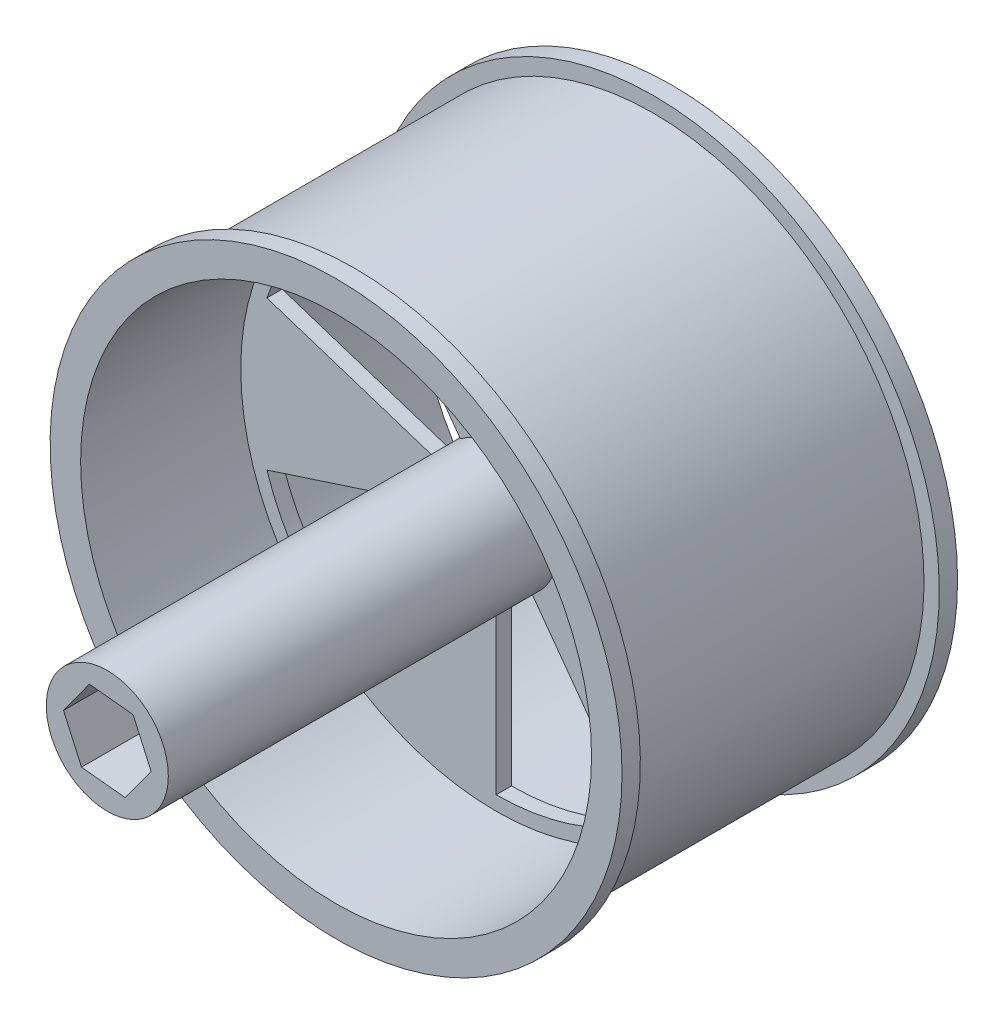
ISO-10303-21;
HEADER;
FILE_DESCRIPTION(('STEP AP214'),'2;1');
FILE_NAME('part.step','',(''),(''),'','','');
FILE_SCHEMA(('AUTOMOTIVE_DESIGN { 1 0 10303 214 1 1 1 1 }'));
ENDSEC;
DATA;
#1=APPLICATION_CONTEXT('core data for automotive mechanical design processes');
#2=APPLICATION_PROTOCOL_DEFINITION('international standard','automotive_design',2000,#1);
#3=PRODUCT_CONTEXT('',#1,'mechanical');
#4=PRODUCT('Part','Part','',(#3));
#5=PRODUCT_RELATED_PRODUCT_CATEGORY('part','',(#4));
#6=PRODUCT_DEFINITION_FORMATION('','',#4);
#7=PRODUCT_DEFINITION_CONTEXT('part definition',#1,'design');
#8=PRODUCT_DEFINITION('design','',#6,#7);
#9=PRODUCT_DEFINITION_SHAPE('','',#8);
#10=(LENGTH_UNIT() NAMED_UNIT(*) SI_UNIT(.MILLI.,.METRE.));
#11=(NAMED_UNIT(*) PLANE_ANGLE_UNIT() SI_UNIT($,.RADIAN.));
#12=(NAMED_UNIT(*) SI_UNIT($,.STERADIAN.) SOLID_ANGLE_UNIT());
#13=UNCERTAINTY_MEASURE_WITH_UNIT(LENGTH_MEASURE(1.E-05),#10,'distance_accuracy_value','');
#14=(GEOMETRIC_REPRESENTATION_CONTEXT(3) GLOBAL_UNCERTAINTY_ASSIGNED_CONTEXT((#13)) GLOBAL_UNIT_ASSIGNED_CONTEXT((#10,
#11,#12)) REPRESENTATION_CONTEXT('',''));
#15=CARTESIAN_POINT('',(0.,0.,0.));
#16=DIRECTION('',(0.,0.,1.));
#17=DIRECTION('',(1.,0.,0.));
#18=AXIS2_PLACEMENT_3D('',#15,#16,#17);
#19=CARTESIAN_POINT('',(0.,0.,14.605));
#20=DIRECTION('',(0.,0.,1.));
#21=DIRECTION('',(1.,0.,0.));
#22=AXIS2_PLACEMENT_3D('',#19,#20,#21);
#23=PLANE('',#22);
#24=CARTESIAN_POINT('',(0.,0.,14.605));
#25=DIRECTION('',(0.,0.,1.));
#26=DIRECTION('',(1.,0.,0.));
#27=AXIS2_PLACEMENT_3D('',#24,#25,#26);
#28=CIRCLE('',#27,21.2725);
#29=CARTESIAN_POINT('',(21.2725,0.,14.605));
#30=VERTEX_POINT('',#29);
#31=EDGE_CURVE('E483',#30,#30,#28,.T.);
#32=ORIENTED_EDGE('',*,*,#31,.T.);
#33=EDGE_LOOP('',(#32));
#34=FACE_BOUND('',#33,.T.);
#35=DIRECTION('',(0.951056516295152,-0.309016994374953,0.));
#36=VECTOR('',#35,1.);
#37=CARTESIAN_POINT('',(0.,0.,14.605));
#38=LINE('',#37,#36);
#39=CARTESIAN_POINT('',(4.83136710277938,-1.56980633142474,14.605));
#40=VERTEX_POINT('',#39);
#41=CARTESIAN_POINT('',(19.0936857187198,-6.20391456369309,14.605));
#42=VERTEX_POINT('',#41);
#43=EDGE_CURVE('E516',#40,#42,#38,.T.);
#44=ORIENTED_EDGE('',*,*,#43,.F.);
#45=CARTESIAN_POINT('',(0.,0.,14.605));
#46=DIRECTION('',(0.,0.,1.));
#47=DIRECTION('',(1.,0.,0.));
#48=AXIS2_PLACEMENT_3D('',#45,#46,#47);
#49=CIRCLE('',#48,5.08);
#50=CARTESIAN_POINT('',(2.98594908164576,-4.10980633142473,14.605));
#51=VERTEX_POINT('',#50);
#52=EDGE_CURVE('E277',#51,#40,#49,.T.);
#53=ORIENTED_EDGE('',*,*,#52,.F.);
#54=DIRECTION('',(-0.587785252292467,0.809016994374952,0.));
#55=VECTOR('',#54,1.);
#56=CARTESIAN_POINT('',(0.,0.,14.605));
#57=LINE('',#56,#55);
#58=CARTESIAN_POINT('',(11.8005467446771,-16.2420591910488,14.605));
#59=VERTEX_POINT('',#58);
#60=EDGE_CURVE('E501',#59,#51,#57,.T.);
#61=ORIENTED_EDGE('',*,*,#60,.F.);
#62=CARTESIAN_POINT('',(0.,0.,14.605));
#63=DIRECTION('',(0.,0.,1.));
#64=DIRECTION('',(1.,0.,0.));
#65=AXIS2_PLACEMENT_3D('',#62,#63,#64);
#66=CIRCLE('',#65,20.0762892547115);
#67=CARTESIAN_POINT('',(-1.42681005899092E-13,-20.0762892547115,14.605));
#68=VERTEX_POINT('',#67);
#69=EDGE_CURVE('E508',#68,#59,#66,.T.);
#70=ORIENTED_EDGE('',*,*,#69,.F.);
#71=DIRECTION('',(0.,-1.,0.));
#72=VECTOR('',#71,1.);
#73=CARTESIAN_POINT('',(0.,0.,14.605));
#74=LINE('',#73,#72);
#75=CARTESIAN_POINT('',(0.,-5.08,14.605));
#76=VERTEX_POINT('',#75);
#77=EDGE_CURVE('E505',#76,#68,#74,.T.);
#78=ORIENTED_EDGE('',*,*,#77,.F.);
#79=CARTESIAN_POINT('',(-2.98594908164576,-4.10980633142473,14.605));
#80=VERTEX_POINT('',#79);
#81=EDGE_CURVE('E922',#80,#76,#49,.T.);
#82=ORIENTED_EDGE('',*,*,#81,.F.);
#83=DIRECTION('',(0.587785252292483,0.80901699437494,0.));
#84=VECTOR('',#83,1.);
#85=CARTESIAN_POINT('',(0.,0.,14.605));
#86=LINE('',#85,#84);
#87=CARTESIAN_POINT('',(-11.8005467446775,-16.2420591910487,14.605));
#88=VERTEX_POINT('',#87);
#89=EDGE_CURVE('E523',#88,#80,#86,.T.);
#90=ORIENTED_EDGE('',*,*,#89,.F.);
#91=CARTESIAN_POINT('',(0.,0.,14.605));
#92=DIRECTION('',(0.,0.,1.));
#93=DIRECTION('',(1.,0.,0.));
#94=AXIS2_PLACEMENT_3D('',#91,#92,#93);
#95=CIRCLE('',#94,20.0762892547115);
#96=CARTESIAN_POINT('',(-19.0936857187198,-6.20391456369282,14.605));
#97=VERTEX_POINT('',#96);
#98=EDGE_CURVE('E530',#97,#88,#95,.T.);
#99=ORIENTED_EDGE('',*,*,#98,.F.);
#100=DIRECTION('',(-0.951056516295158,-0.309016994374935,0.));
#101=VECTOR('',#100,1.);
#102=CARTESIAN_POINT('',(0.,0.,14.605));
#103=LINE('',#102,#101);
#104=CARTESIAN_POINT('',(-4.83136710277938,-1.56980633142473,14.605));
#105=VERTEX_POINT('',#104);
#106=EDGE_CURVE('E527',#105,#97,#103,.T.);
#107=ORIENTED_EDGE('',*,*,#106,.F.);
#108=CARTESIAN_POINT('',(-4.83136710277938,1.56980633142473,14.605));
#109=VERTEX_POINT('',#108);
#110=EDGE_CURVE('E550',#109,#105,#49,.T.);
#111=ORIENTED_EDGE('',*,*,#110,.F.);
#112=DIRECTION('',(0.951056516295149,-0.309016994374962,0.));
#113=VECTOR('',#112,1.);
#114=CARTESIAN_POINT('',(0.,0.,14.605));
#115=LINE('',#114,#113);
#116=CARTESIAN_POINT('',(-19.0936857187197,6.20391456369331,14.605));
#117=VERTEX_POINT('',#116);
#118=EDGE_CURVE('E534',#117,#109,#115,.T.);
#119=ORIENTED_EDGE('',*,*,#118,.F.);
#120=CARTESIAN_POINT('',(0.,0.,14.605));
#121=DIRECTION('',(0.,0.,1.));
#122=DIRECTION('',(1.,0.,0.));
#123=AXIS2_PLACEMENT_3D('',#120,#121,#122);
#124=CIRCLE('',#123,20.0762892547115);
#125=CARTESIAN_POINT('',(-11.8005467446771,16.2420591910489,14.605));
#126=VERTEX_POINT('',#125);
#127=EDGE_CURVE('E12',#126,#117,#124,.T.);
#128=ORIENTED_EDGE('',*,*,#127,.F.);
#129=DIRECTION('',(-0.58778525229246,0.809016994374957,0.));
#130=VECTOR('',#129,1.);
#131=CARTESIAN_POINT('',(0.,0.,14.605));
#132=LINE('',#131,#130);
#133=CARTESIAN_POINT('',(-2.98594908164576,4.10980633142474,14.605));
#134=VERTEX_POINT('',#133);
#135=EDGE_CURVE('E50',#134,#126,#132,.T.);
#136=ORIENTED_EDGE('',*,*,#135,.F.);
#137=CARTESIAN_POINT('',(0.,5.08,14.605));
#138=VERTEX_POINT('',#137);
#139=EDGE_CURVE('E293',#138,#134,#49,.T.);
#140=ORIENTED_EDGE('',*,*,#139,.F.);
#141=DIRECTION('',(0.,-1.,0.));
#142=VECTOR('',#141,1.);
#143=CARTESIAN_POINT('',(0.,0.,14.605));
#144=LINE('',#143,#142);
#145=CARTESIAN_POINT('',(0.,20.0762892547115,14.605));
#146=VERTEX_POINT('',#145);
#147=EDGE_CURVE('E490',#146,#138,#144,.T.);
#148=ORIENTED_EDGE('',*,*,#147,.F.);
#149=CARTESIAN_POINT('',(0.,0.,14.605));
#150=DIRECTION('',(0.,0.,1.));
#151=DIRECTION('',(1.,0.,0.));
#152=AXIS2_PLACEMENT_3D('',#149,#150,#151);
#153=CIRCLE('',#152,20.0762892547115);
#154=CARTESIAN_POINT('',(11.8005467446773,16.2420591910488,14.605));
#155=VERTEX_POINT('',#154);
#156=EDGE_CURVE('E497',#155,#146,#153,.T.);
#157=ORIENTED_EDGE('',*,*,#156,.F.);
#158=DIRECTION('',(0.587785252292474,0.809016994374947,0.));
#159=VECTOR('',#158,1.);
#160=CARTESIAN_POINT('',(0.,0.,14.605));
#161=LINE('',#160,#159);
#162=CARTESIAN_POINT('',(2.98594908164577,4.10980633142473,14.605));
#163=VERTEX_POINT('',#162);
#164=EDGE_CURVE('E494',#163,#155,#161,.T.);
#165=ORIENTED_EDGE('',*,*,#164,.F.);
#166=CARTESIAN_POINT('',(4.83136710277938,1.56980633142473,14.605));
#167=VERTEX_POINT('',#166);
#168=EDGE_CURVE('E289',#167,#163,#49,.T.);
#169=ORIENTED_EDGE('',*,*,#168,.F.);
#170=DIRECTION('',(-0.951056516295155,-0.309016994374944,0.));
#171=VECTOR('',#170,1.);
#172=CARTESIAN_POINT('',(0.,0.,14.605));
#173=LINE('',#172,#171);
#174=CARTESIAN_POINT('',(19.0936857187198,6.20391456369294,14.605));
#175=VERTEX_POINT('',#174);
#176=EDGE_CURVE('E512',#175,#167,#173,.T.);
#177=ORIENTED_EDGE('',*,*,#176,.F.);
#178=CARTESIAN_POINT('',(0.,0.,14.605));
#179=DIRECTION('',(0.,0.,1.));
#180=DIRECTION('',(1.,0.,0.));
#181=AXIS2_PLACEMENT_3D('',#178,#179,#180);
#182=CIRCLE('',#181,20.0762892547115);
#183=EDGE_CURVE('E519',#42,#175,#182,.T.);
#184=ORIENTED_EDGE('',*,*,#183,.F.);
#185=EDGE_LOOP('',(#44,#53,#61,#70,#78,#82,#90,#99,#107,#111,#119,#128,#136,#140,#148,#157,#165,
#169,#177,#184));
#186=FACE_BOUND('',#185,.T.);
#187=ADVANCED_FACE('F41',(#34,#186),#23,.T.);
#188=CARTESIAN_POINT('',(0.,0.,27.94));
#189=DIRECTION('',(0.,0.,-1.));
#190=DIRECTION('',(-1.,0.,0.));
#191=AXIS2_PLACEMENT_3D('',#188,#189,#190);
#192=CYLINDRICAL_SURFACE('',#191,21.2725);
#193=CARTESIAN_POINT('',(0.,0.,0.));
#194=DIRECTION('',(0.,0.,1.));
#195=DIRECTION('',(1.,0.,0.));
#196=AXIS2_PLACEMENT_3D('',#193,#194,#195);
#197=CIRCLE('',#196,21.2725);
#198=CARTESIAN_POINT('',(21.2725,0.,0.));
#199=VERTEX_POINT('',#198);
#200=EDGE_CURVE('E470',#199,#199,#197,.T.);
#201=ORIENTED_EDGE('',*,*,#200,.F.);
#202=EDGE_LOOP('',(#201));
#203=FACE_BOUND('',#202,.T.);
#204=CARTESIAN_POINT('',(0.,0.,13.335));
#205=DIRECTION('',(0.,0.,1.));
#206=DIRECTION('',(1.,0.,0.));
#207=AXIS2_PLACEMENT_3D('',#204,#205,#206);
#208=CIRCLE('',#207,21.2725);
#209=CARTESIAN_POINT('',(21.2725,0.,13.335));
#210=VERTEX_POINT('',#209);
#211=EDGE_CURVE('E450',#210,#210,#208,.T.);
#212=ORIENTED_EDGE('',*,*,#211,.T.);
#213=EDGE_LOOP('',(#212));
#214=FACE_BOUND('',#213,.T.);
#215=ADVANCED_FACE('F569',(#203,#214),#192,.F.);
#216=CARTESIAN_POINT('',(0.,0.,27.94));
#217=DIRECTION('',(0.,0.,-1.));
#218=DIRECTION('',(-1.,0.,0.));
#219=AXIS2_PLACEMENT_3D('',#216,#217,#218);
#220=CYLINDRICAL_SURFACE('',#219,23.8125);
#221=CARTESIAN_POINT('',(0.,0.,1.524));
#222=DIRECTION('',(0.,0.,-1.));
#223=DIRECTION('',(0.,1.,0.));
#224=AXIS2_PLACEMENT_3D('',#221,#222,#223);
#225=CIRCLE('',#224,23.8125);
#226=CARTESIAN_POINT('',(0.,23.8125,1.524));
#227=VERTEX_POINT('',#226);
#228=EDGE_CURVE('E454',#227,#227,#225,.T.);
#229=ORIENTED_EDGE('',*,*,#228,.T.);
#230=EDGE_LOOP('',(#229));
#231=FACE_BOUND('',#230,.T.);
#232=CARTESIAN_POINT('',(0.,0.,0.));
#233=DIRECTION('',(0.,0.,1.));
#234=DIRECTION('',(1.,0.,0.));
#235=AXIS2_PLACEMENT_3D('',#232,#233,#234);
#236=CIRCLE('',#235,23.8125);
#237=CARTESIAN_POINT('',(23.8125,0.,0.));
#238=VERTEX_POINT('',#237);
#239=EDGE_CURVE('E475',#238,#238,#236,.T.);
#240=ORIENTED_EDGE('',*,*,#239,.T.);
#241=EDGE_LOOP('',(#240));
#242=FACE_BOUND('',#241,.T.);
#243=ADVANCED_FACE('F571',(#231,#242),#220,.T.);
#244=CARTESIAN_POINT('',(0.,0.,27.94));
#245=DIRECTION('',(0.,0.,1.));
#246=DIRECTION('',(1.,0.,0.));
#247=AXIS2_PLACEMENT_3D('',#244,#245,#246);
#248=PLANE('',#247);
#249=CARTESIAN_POINT('',(0.,0.,27.94));
#250=DIRECTION('',(0.,0.,1.));
#251=DIRECTION('',(1.,0.,0.));
#252=AXIS2_PLACEMENT_3D('',#249,#250,#251);
#253=CIRCLE('',#252,23.8125);
#254=CARTESIAN_POINT('',(23.8125,0.,27.94));
#255=VERTEX_POINT('',#254);
#256=EDGE_CURVE('E479',#255,#255,#253,.T.);
#257=ORIENTED_EDGE('',*,*,#256,.T.);
#258=EDGE_LOOP('',(#257));
#259=FACE_BOUND('',#258,.T.);
#260=CARTESIAN_POINT('',(0.,0.,27.94));
#261=DIRECTION('',(0.,0.,1.));
#262=DIRECTION('',(1.,0.,0.));
#263=AXIS2_PLACEMENT_3D('',#260,#261,#262);
#264=CIRCLE('',#263,21.2725);
#265=CARTESIAN_POINT('',(21.2725,0.,27.94));
#266=VERTEX_POINT('',#265);
#267=EDGE_CURVE('E471',#266,#266,#264,.T.);
#268=ORIENTED_EDGE('',*,*,#267,.F.);
#269=EDGE_LOOP('',(#268));
#270=FACE_BOUND('',#269,.T.);
#271=ADVANCED_FACE('F579',(#259,#270),#248,.T.);
#272=CARTESIAN_POINT('',(0.,0.,0.));
#273=DIRECTION('',(0.,0.,1.));
#274=DIRECTION('',(1.,0.,0.));
#275=AXIS2_PLACEMENT_3D('',#272,#273,#274);
#276=PLANE('',#275);
#277=ORIENTED_EDGE('',*,*,#239,.F.);
#278=EDGE_LOOP('',(#277));
#279=FACE_BOUND('',#278,.T.);
#280=ORIENTED_EDGE('',*,*,#200,.T.);
#281=EDGE_LOOP('',(#280));
#282=FACE_BOUND('',#281,.T.);
#283=ADVANCED_FACE('F595',(#279,#282),#276,.F.);
#284=CARTESIAN_POINT('',(0.,0.,26.416));
#285=DIRECTION('',(0.,0.,-1.));
#286=DIRECTION('',(0.,1.,0.));
#287=AXIS2_PLACEMENT_3D('',#284,#285,#286);
#288=CIRCLE('',#287,23.8125);
#289=CARTESIAN_POINT('',(0.,23.8125,26.416));
#290=VERTEX_POINT('',#289);
#291=EDGE_CURVE('E458',#290,#290,#288,.T.);
#292=ORIENTED_EDGE('',*,*,#291,.F.);
#293=EDGE_LOOP('',(#292));
#294=FACE_BOUND('',#293,.T.);
#295=ORIENTED_EDGE('',*,*,#256,.F.);
#296=EDGE_LOOP('',(#295));
#297=FACE_BOUND('',#296,.T.);
#298=ADVANCED_FACE('F43',(#294,#297),#220,.T.);
#299=ORIENTED_EDGE('',*,*,#31,.F.);
#300=EDGE_LOOP('',(#299));
#301=FACE_BOUND('',#300,.T.);
#302=ORIENTED_EDGE('',*,*,#267,.T.);
#303=EDGE_LOOP('',(#302));
#304=FACE_BOUND('',#303,.T.);
#305=ADVANCED_FACE('F574',(#301,#304),#192,.F.);
#306=CARTESIAN_POINT('',(0.,23.8125,1.524));
#307=DIRECTION('',(0.,0.,-1.));
#308=DIRECTION('',(0.,1.,0.));
#309=AXIS2_PLACEMENT_3D('',#306,#307,#308);
#310=PLANE('',#309);
#311=ORIENTED_EDGE('',*,*,#228,.F.);
#312=EDGE_LOOP('',(#311));
#313=FACE_BOUND('',#312,.T.);
#314=CARTESIAN_POINT('',(0.,0.,1.524));
#315=DIRECTION('',(0.,0.,-1.));
#316=DIRECTION('',(0.,1.,0.));
#317=AXIS2_PLACEMENT_3D('',#314,#315,#316);
#318=CIRCLE('',#317,22.5425);
#319=CARTESIAN_POINT('',(0.,22.5425,1.524));
#320=VERTEX_POINT('',#319);
#321=EDGE_CURVE('E466',#320,#320,#318,.T.);
#322=ORIENTED_EDGE('',*,*,#321,.T.);
#323=EDGE_LOOP('',(#322));
#324=FACE_BOUND('',#323,.T.);
#325=ADVANCED_FACE('F587',(#313,#324),#310,.F.);
#326=CARTESIAN_POINT('',(0.,0.,0.));
#327=DIRECTION('',(0.,0.,-1.));
#328=DIRECTION('',(0.,1.,0.));
#329=AXIS2_PLACEMENT_3D('',#326,#327,#328);
#330=CYLINDRICAL_SURFACE('',#329,22.5425);
#331=ORIENTED_EDGE('',*,*,#321,.F.);
#332=EDGE_LOOP('',(#331));
#333=FACE_BOUND('',#332,.T.);
#334=CARTESIAN_POINT('',(0.,0.,26.416));
#335=DIRECTION('',(0.,0.,-1.));
#336=DIRECTION('',(0.,1.,0.));
#337=AXIS2_PLACEMENT_3D('',#334,#335,#336);
#338=CIRCLE('',#337,22.5425);
#339=CARTESIAN_POINT('',(0.,22.5425,26.416));
#340=VERTEX_POINT('',#339);
#341=EDGE_CURVE('E462',#340,#340,#338,.T.);
#342=ORIENTED_EDGE('',*,*,#341,.T.);
#343=EDGE_LOOP('',(#342));
#344=FACE_BOUND('',#343,.T.);
#345=ADVANCED_FACE('F593',(#333,#344),#330,.T.);
#346=CARTESIAN_POINT('',(0.,23.8125,26.416));
#347=DIRECTION('',(0.,0.,1.));
#348=DIRECTION('',(0.,-1.,0.));
#349=AXIS2_PLACEMENT_3D('',#346,#347,#348);
#350=PLANE('',#349);
#351=ORIENTED_EDGE('',*,*,#341,.F.);
#352=EDGE_LOOP('',(#351));
#353=FACE_BOUND('',#352,.T.);
#354=ORIENTED_EDGE('',*,*,#291,.T.);
#355=EDGE_LOOP('',(#354));
#356=FACE_BOUND('',#355,.T.);
#357=ADVANCED_FACE('F561',(#353,#356),#350,.F.);
#358=CARTESIAN_POINT('',(0.,0.,13.335));
#359=DIRECTION('',(0.,0.,1.));
#360=DIRECTION('',(1.,0.,0.));
#361=AXIS2_PLACEMENT_3D('',#358,#359,#360);
#362=PLANE('',#361);
#363=DIRECTION('',(-0.58778525229246,0.809016994374957,0.));
#364=VECTOR('',#363,1.);
#365=CARTESIAN_POINT('',(0.,0.,13.335));
#366=LINE('',#365,#364);
#367=CARTESIAN_POINT('',(-2.98594908164576,4.10980633142474,13.335));
#368=VERTEX_POINT('',#367);
#369=CARTESIAN_POINT('',(-11.8005467446771,16.2420591910489,13.335));
#370=VERTEX_POINT('',#369);
#371=EDGE_CURVE('E442',#368,#370,#366,.T.);
#372=ORIENTED_EDGE('',*,*,#371,.T.);
#373=CARTESIAN_POINT('',(0.,0.,13.335));
#374=DIRECTION('',(0.,0.,1.));
#375=DIRECTION('',(1.,0.,0.));
#376=AXIS2_PLACEMENT_3D('',#373,#374,#375);
#377=CIRCLE('',#376,20.0762892547115);
#378=CARTESIAN_POINT('',(-19.0936857187197,6.20391456369323,13.335));
#379=VERTEX_POINT('',#378);
#380=EDGE_CURVE('E446',#370,#379,#377,.T.);
#381=ORIENTED_EDGE('',*,*,#380,.T.);
#382=DIRECTION('',(0.951056516295149,-0.309016994374962,0.));
#383=VECTOR('',#382,1.);
#384=CARTESIAN_POINT('',(0.,0.,13.335));
#385=LINE('',#384,#383);
#386=CARTESIAN_POINT('',(-4.83136710277938,1.56980633142482,13.335));
#387=VERTEX_POINT('',#386);
#388=EDGE_CURVE('E434',#379,#387,#385,.T.);
#389=ORIENTED_EDGE('',*,*,#388,.T.);
#390=CARTESIAN_POINT('',(0.,0.,13.335));
#391=DIRECTION('',(0.,0.,1.));
#392=DIRECTION('',(1.,0.,0.));
#393=AXIS2_PLACEMENT_3D('',#390,#391,#392);
#394=CIRCLE('',#393,5.08);
#395=EDGE_CURVE('E438',#387,#368,#394,.F.);
#396=ORIENTED_EDGE('',*,*,#395,.T.);
#397=EDGE_LOOP('',(#372,#381,#389,#396));
#398=FACE_BOUND('',#397,.T.);
#399=DIRECTION('',(-0.951056516295158,-0.309016994374935,0.));
#400=VECTOR('',#399,1.);
#401=CARTESIAN_POINT('',(0.,0.,13.335));
#402=LINE('',#401,#400);
#403=CARTESIAN_POINT('',(-4.83136710277938,-1.56980633142473,13.335));
#404=VERTEX_POINT('',#403);
#405=CARTESIAN_POINT('',(-19.0936857187198,-6.20391456369282,13.335));
#406=VERTEX_POINT('',#405);
#407=EDGE_CURVE('E426',#404,#406,#402,.T.);
#408=ORIENTED_EDGE('',*,*,#407,.T.);
#409=CARTESIAN_POINT('',(0.,0.,13.335));
#410=DIRECTION('',(0.,0.,1.));
#411=DIRECTION('',(1.,0.,0.));
#412=AXIS2_PLACEMENT_3D('',#409,#410,#411);
#413=CIRCLE('',#412,20.0762892547115);
#414=CARTESIAN_POINT('',(-11.8005467446774,-16.2420591910487,13.335));
#415=VERTEX_POINT('',#414);
#416=EDGE_CURVE('E430',#406,#415,#413,.T.);
#417=ORIENTED_EDGE('',*,*,#416,.T.);
#418=DIRECTION('',(0.587785252292483,0.80901699437494,0.));
#419=VECTOR('',#418,1.);
#420=CARTESIAN_POINT('',(0.,0.,13.335));
#421=LINE('',#420,#419);
#422=CARTESIAN_POINT('',(-2.98594908164584,-4.10980633142473,13.335));
#423=VERTEX_POINT('',#422);
#424=EDGE_CURVE('E418',#415,#423,#421,.T.);
#425=ORIENTED_EDGE('',*,*,#424,.T.);
#426=CARTESIAN_POINT('',(0.,0.,13.335));
#427=DIRECTION('',(0.,0.,1.));
#428=DIRECTION('',(1.,0.,0.));
#429=AXIS2_PLACEMENT_3D('',#426,#427,#428);
#430=CIRCLE('',#429,5.08);
#431=EDGE_CURVE('E422',#423,#404,#430,.F.);
#432=ORIENTED_EDGE('',*,*,#431,.T.);
#433=EDGE_LOOP('',(#408,#417,#425,#432));
#434=FACE_BOUND('',#433,.T.);
#435=DIRECTION('',(0.951056516295152,-0.309016994374953,0.));
#436=VECTOR('',#435,1.);
#437=CARTESIAN_POINT('',(0.,0.,13.335));
#438=LINE('',#437,#436);
#439=CARTESIAN_POINT('',(4.83136710277938,-1.56980633142474,13.335));
#440=VERTEX_POINT('',#439);
#441=CARTESIAN_POINT('',(19.0936857187198,-6.20391456369309,13.335));
#442=VERTEX_POINT('',#441);
#443=EDGE_CURVE('E410',#440,#442,#438,.T.);
#444=ORIENTED_EDGE('',*,*,#443,.T.);
#445=CARTESIAN_POINT('',(0.,0.,13.335));
#446=DIRECTION('',(0.,0.,1.));
#447=DIRECTION('',(1.,0.,0.));
#448=AXIS2_PLACEMENT_3D('',#445,#446,#447);
#449=CIRCLE('',#448,20.0762892547115);
#450=CARTESIAN_POINT('',(19.0936857187198,6.20391456369296,13.335));
#451=VERTEX_POINT('',#450);
#452=EDGE_CURVE('E414',#442,#451,#449,.T.);
#453=ORIENTED_EDGE('',*,*,#452,.T.);
#454=DIRECTION('',(-0.951056516295155,-0.309016994374944,0.));
#455=VECTOR('',#454,1.);
#456=CARTESIAN_POINT('',(0.,0.,13.335));
#457=LINE('',#456,#455);
#458=CARTESIAN_POINT('',(4.83136710277938,1.56980633142471,13.335));
#459=VERTEX_POINT('',#458);
#460=EDGE_CURVE('E402',#451,#459,#457,.T.);
#461=ORIENTED_EDGE('',*,*,#460,.T.);
#462=CARTESIAN_POINT('',(0.,0.,13.335));
#463=DIRECTION('',(0.,0.,1.));
#464=DIRECTION('',(1.,0.,0.));
#465=AXIS2_PLACEMENT_3D('',#462,#463,#464);
#466=CIRCLE('',#465,5.08);
#467=EDGE_CURVE('E406',#459,#440,#466,.F.);
#468=ORIENTED_EDGE('',*,*,#467,.T.);
#469=EDGE_LOOP('',(#444,#453,#461,#468));
#470=FACE_BOUND('',#469,.T.);
#471=DIRECTION('',(0.,-1.,0.));
#472=VECTOR('',#471,1.);
#473=CARTESIAN_POINT('',(0.,0.,13.335));
#474=LINE('',#473,#472);
#475=CARTESIAN_POINT('',(0.,-5.08,13.335));
#476=VERTEX_POINT('',#475);
#477=CARTESIAN_POINT('',(-1.42681005899092E-13,-20.0762892547115,13.335));
#478=VERTEX_POINT('',#477);
#479=EDGE_CURVE('E394',#476,#478,#474,.T.);
#480=ORIENTED_EDGE('',*,*,#479,.T.);
#481=CARTESIAN_POINT('',(0.,0.,13.335));
#482=DIRECTION('',(0.,0.,1.));
#483=DIRECTION('',(1.,0.,0.));
#484=AXIS2_PLACEMENT_3D('',#481,#482,#483);
#485=CIRCLE('',#484,20.0762892547115);
#486=CARTESIAN_POINT('',(11.8005467446772,-16.2420591910488,13.335));
#487=VERTEX_POINT('',#486);
#488=EDGE_CURVE('E398',#478,#487,#485,.T.);
#489=ORIENTED_EDGE('',*,*,#488,.T.);
#490=DIRECTION('',(-0.587785252292467,0.809016994374952,0.));
#491=VECTOR('',#490,1.);
#492=CARTESIAN_POINT('',(0.,0.,13.335));
#493=LINE('',#492,#491);
#494=CARTESIAN_POINT('',(2.98594908164572,-4.10980633142473,13.335));
#495=VERTEX_POINT('',#494);
#496=EDGE_CURVE('E386',#487,#495,#493,.T.);
#497=ORIENTED_EDGE('',*,*,#496,.T.);
#498=CARTESIAN_POINT('',(0.,0.,13.335));
#499=DIRECTION('',(0.,0.,1.));
#500=DIRECTION('',(1.,0.,0.));
#501=AXIS2_PLACEMENT_3D('',#498,#499,#500);
#502=CIRCLE('',#501,5.08);
#503=EDGE_CURVE('E390',#495,#476,#502,.F.);
#504=ORIENTED_EDGE('',*,*,#503,.T.);
#505=EDGE_LOOP('',(#480,#489,#497,#504));
#506=FACE_BOUND('',#505,.T.);
#507=DIRECTION('',(0.587785252292474,0.809016994374947,0.));
#508=VECTOR('',#507,1.);
#509=CARTESIAN_POINT('',(0.,0.,13.335));
#510=LINE('',#509,#508);
#511=CARTESIAN_POINT('',(2.98594908164577,4.10980633142473,13.335));
#512=VERTEX_POINT('',#511);
#513=CARTESIAN_POINT('',(11.8005467446773,16.2420591910488,13.335));
#514=VERTEX_POINT('',#513);
#515=EDGE_CURVE('E378',#512,#514,#510,.T.);
#516=ORIENTED_EDGE('',*,*,#515,.T.);
#517=CARTESIAN_POINT('',(0.,0.,13.335));
#518=DIRECTION('',(0.,0.,1.));
#519=DIRECTION('',(1.,0.,0.));
#520=AXIS2_PLACEMENT_3D('',#517,#518,#519);
#521=CIRCLE('',#520,20.0762892547115);
#522=CARTESIAN_POINT('',(0.,20.0762892547115,13.335));
#523=VERTEX_POINT('',#522);
#524=EDGE_CURVE('E382',#514,#523,#521,.T.);
#525=ORIENTED_EDGE('',*,*,#524,.T.);
#526=DIRECTION('',(0.,-1.,0.));
#527=VECTOR('',#526,1.);
#528=CARTESIAN_POINT('',(0.,0.,13.335));
#529=LINE('',#528,#527);
#530=CARTESIAN_POINT('',(0.,5.08,13.335));
#531=VERTEX_POINT('',#530);
#532=EDGE_CURVE('E360',#523,#531,#529,.T.);
#533=ORIENTED_EDGE('',*,*,#532,.T.);
#534=CARTESIAN_POINT('',(0.,0.,13.335));
#535=DIRECTION('',(0.,0.,1.));
#536=DIRECTION('',(1.,0.,0.));
#537=AXIS2_PLACEMENT_3D('',#534,#535,#536);
#538=CIRCLE('',#537,5.08);
#539=EDGE_CURVE('E374',#531,#512,#538,.F.);
#540=ORIENTED_EDGE('',*,*,#539,.T.);
#541=EDGE_LOOP('',(#516,#525,#533,#540));
#542=FACE_BOUND('',#541,.T.);
#543=ORIENTED_EDGE('',*,*,#211,.F.);
#544=EDGE_LOOP('',(#543));
#545=FACE_BOUND('',#544,.T.);
#546=ADVANCED_FACE('F557',(#398,#434,#470,#506,#542,#545),#362,.F.);
#547=CARTESIAN_POINT('',(0.,0.,0.));
#548=DIRECTION('',(0.,0.,1.));
#549=DIRECTION('',(1.,0.,0.));
#550=AXIS2_PLACEMENT_3D('',#547,#548,#549);
#551=CYLINDRICAL_SURFACE('',#550,20.0762892547115);
#552=DIRECTION('',(0.,0.,1.));
#553=VECTOR('',#552,1.);
#554=CARTESIAN_POINT('',(11.8005467446773,16.2420591910488,0.));
#555=LINE('',#554,#553);
#556=EDGE_CURVE('E356',#514,#155,#555,.T.);
#557=ORIENTED_EDGE('',*,*,#556,.T.);
#558=ORIENTED_EDGE('',*,*,#156,.T.);
#559=DIRECTION('',(0.,0.,1.));
#560=VECTOR('',#559,1.);
#561=CARTESIAN_POINT('',(0.,20.0762892547115,0.));
#562=LINE('',#561,#560);
#563=EDGE_CURVE('E319',#523,#146,#562,.T.);
#564=ORIENTED_EDGE('',*,*,#563,.F.);
#565=ORIENTED_EDGE('',*,*,#524,.F.);
#566=EDGE_LOOP('',(#557,#558,#564,#565));
#567=FACE_BOUND('',#566,.T.);
#568=ADVANCED_FACE('F560',(#567),#551,.F.);
#569=CARTESIAN_POINT('',(2.98594908164577,4.10980633142473,0.));
#570=DIRECTION('',(0.809016994374947,-0.587785252292474,0.));
#571=DIRECTION('',(0.587785252292474,0.809016994374947,0.));
#572=AXIS2_PLACEMENT_3D('',#569,#570,#571);
#573=PLANE('',#572);
#574=DIRECTION('',(0.,0.,1.));
#575=VECTOR('',#574,1.);
#576=CARTESIAN_POINT('',(2.98594908164577,4.10980633142473,0.));
#577=LINE('',#576,#575);
#578=EDGE_CURVE('E361',#512,#163,#577,.T.);
#579=ORIENTED_EDGE('',*,*,#578,.T.);
#580=ORIENTED_EDGE('',*,*,#164,.T.);
#581=ORIENTED_EDGE('',*,*,#556,.F.);
#582=ORIENTED_EDGE('',*,*,#515,.F.);
#583=EDGE_LOOP('',(#579,#580,#581,#582));
#584=FACE_BOUND('',#583,.T.);
#585=ADVANCED_FACE('F668',(#584),#573,.F.);
#586=CARTESIAN_POINT('',(0.,5.08,0.));
#587=DIRECTION('',(-1.,0.,0.));
#588=DIRECTION('',(0.,0.,1.));
#589=AXIS2_PLACEMENT_3D('',#586,#587,#588);
#590=PLANE('',#589);
#591=ORIENTED_EDGE('',*,*,#563,.T.);
#592=ORIENTED_EDGE('',*,*,#147,.T.);
#593=DIRECTION('',(0.,0.,1.));
#594=VECTOR('',#593,1.);
#595=CARTESIAN_POINT('',(0.,5.08,0.));
#596=LINE('',#595,#594);
#597=EDGE_CURVE('E365',#531,#138,#596,.T.);
#598=ORIENTED_EDGE('',*,*,#597,.F.);
#599=ORIENTED_EDGE('',*,*,#532,.F.);
#600=EDGE_LOOP('',(#591,#592,#598,#599));
#601=FACE_BOUND('',#600,.T.);
#602=ADVANCED_FACE('F682',(#601),#590,.F.);
#603=CARTESIAN_POINT('',(0.,0.,0.));
#604=DIRECTION('',(0.,0.,1.));
#605=DIRECTION('',(1.,0.,0.));
#606=AXIS2_PLACEMENT_3D('',#603,#604,#605);
#607=CYLINDRICAL_SURFACE('',#606,20.0762892547115);
#608=DIRECTION('',(0.,0.,1.));
#609=VECTOR('',#608,1.);
#610=CARTESIAN_POINT('',(-1.42681005899092E-13,-20.0762892547115,0.));
#611=LINE('',#610,#609);
#612=EDGE_CURVE('E298',#478,#68,#611,.T.);
#613=ORIENTED_EDGE('',*,*,#612,.T.);
#614=ORIENTED_EDGE('',*,*,#69,.T.);
#615=DIRECTION('',(0.,0.,1.));
#616=VECTOR('',#615,1.);
#617=CARTESIAN_POINT('',(11.8005467446772,-16.2420591910488,0.));
#618=LINE('',#617,#616);
#619=EDGE_CURVE('E311',#487,#59,#618,.T.);
#620=ORIENTED_EDGE('',*,*,#619,.F.);
#621=ORIENTED_EDGE('',*,*,#488,.F.);
#622=EDGE_LOOP('',(#613,#614,#620,#621));
#623=FACE_BOUND('',#622,.T.);
#624=ADVANCED_FACE('F676',(#623),#607,.F.);
#625=CARTESIAN_POINT('',(0.,-5.08,0.));
#626=DIRECTION('',(-1.,0.,0.));
#627=DIRECTION('',(0.,-1.,0.));
#628=AXIS2_PLACEMENT_3D('',#625,#626,#627);
#629=PLANE('',#628);
#630=DIRECTION('',(0.,0.,1.));
#631=VECTOR('',#630,1.);
#632=CARTESIAN_POINT('',(0.,-5.08,0.));
#633=LINE('',#632,#631);
#634=EDGE_CURVE('E303',#476,#76,#633,.T.);
#635=ORIENTED_EDGE('',*,*,#634,.T.);
#636=ORIENTED_EDGE('',*,*,#77,.T.);
#637=ORIENTED_EDGE('',*,*,#612,.F.);
#638=ORIENTED_EDGE('',*,*,#479,.F.);
#639=EDGE_LOOP('',(#635,#636,#637,#638));
#640=FACE_BOUND('',#639,.T.);
#641=ADVANCED_FACE('F681',(#640),#629,.F.);
#642=CARTESIAN_POINT('',(2.98594908164576,-4.10980633142473,0.));
#643=DIRECTION('',(0.809016994374952,0.587785252292467,0.));
#644=DIRECTION('',(-0.587785252292467,0.809016994374952,0.));
#645=AXIS2_PLACEMENT_3D('',#642,#643,#644);
#646=PLANE('',#645);
#647=ORIENTED_EDGE('',*,*,#619,.T.);
#648=ORIENTED_EDGE('',*,*,#60,.T.);
#649=DIRECTION('',(0.,0.,1.));
#650=VECTOR('',#649,1.);
#651=CARTESIAN_POINT('',(2.98594908164576,-4.10980633142473,0.));
#652=LINE('',#651,#650);
#653=EDGE_CURVE('E307',#495,#51,#652,.T.);
#654=ORIENTED_EDGE('',*,*,#653,.F.);
#655=ORIENTED_EDGE('',*,*,#496,.F.);
#656=EDGE_LOOP('',(#647,#648,#654,#655));
#657=FACE_BOUND('',#656,.T.);
#658=ADVANCED_FACE('F698',(#657),#646,.F.);
#659=CARTESIAN_POINT('',(0.,0.,0.));
#660=DIRECTION('',(0.,0.,1.));
#661=DIRECTION('',(1.,0.,0.));
#662=AXIS2_PLACEMENT_3D('',#659,#660,#661);
#663=CYLINDRICAL_SURFACE('',#662,20.0762892547115);
#664=DIRECTION('',(0.,0.,1.));
#665=VECTOR('',#664,1.);
#666=CARTESIAN_POINT('',(19.0936857187198,-6.20391456369309,0.));
#667=LINE('',#666,#665);
#668=EDGE_CURVE('E315',#442,#42,#667,.T.);
#669=ORIENTED_EDGE('',*,*,#668,.T.);
#670=ORIENTED_EDGE('',*,*,#183,.T.);
#671=DIRECTION('',(0.,0.,1.));
#672=VECTOR('',#671,1.);
#673=CARTESIAN_POINT('',(19.0936857187198,6.20391456369296,0.));
#674=LINE('',#673,#672);
#675=EDGE_CURVE('E302',#451,#175,#674,.T.);
#676=ORIENTED_EDGE('',*,*,#675,.F.);
#677=ORIENTED_EDGE('',*,*,#452,.F.);
#678=EDGE_LOOP('',(#669,#670,#676,#677));
#679=FACE_BOUND('',#678,.T.);
#680=ADVANCED_FACE('F692',(#679),#663,.F.);
#681=CARTESIAN_POINT('',(4.83136710277938,-1.56980633142474,0.));
#682=DIRECTION('',(-0.309016994374952,-0.951056516295152,0.));
#683=DIRECTION('',(0.951056516295152,-0.309016994374953,0.));
#684=AXIS2_PLACEMENT_3D('',#681,#682,#683);
#685=PLANE('',#684);
#686=DIRECTION('',(0.,0.,1.));
#687=VECTOR('',#686,1.);
#688=CARTESIAN_POINT('',(4.83136710277938,-1.56980633142474,0.));
#689=LINE('',#688,#687);
#690=EDGE_CURVE('E320',#440,#40,#689,.T.);
#691=ORIENTED_EDGE('',*,*,#690,.T.);
#692=ORIENTED_EDGE('',*,*,#43,.T.);
#693=ORIENTED_EDGE('',*,*,#668,.F.);
#694=ORIENTED_EDGE('',*,*,#443,.F.);
#695=EDGE_LOOP('',(#691,#692,#693,#694));
#696=FACE_BOUND('',#695,.T.);
#697=ADVANCED_FACE('F697',(#696),#685,.F.);
#698=CARTESIAN_POINT('',(4.83136710277938,1.56980633142473,0.));
#699=DIRECTION('',(-0.309016994374944,0.951056516295155,0.));
#700=DIRECTION('',(-0.951056516295155,-0.309016994374944,0.));
#701=AXIS2_PLACEMENT_3D('',#698,#699,#700);
#702=PLANE('',#701);
#703=ORIENTED_EDGE('',*,*,#675,.T.);
#704=ORIENTED_EDGE('',*,*,#176,.T.);
#705=DIRECTION('',(0.,0.,1.));
#706=VECTOR('',#705,1.);
#707=CARTESIAN_POINT('',(4.83136710277938,1.56980633142473,0.));
#708=LINE('',#707,#706);
#709=EDGE_CURVE('E324',#459,#167,#708,.T.);
#710=ORIENTED_EDGE('',*,*,#709,.F.);
#711=ORIENTED_EDGE('',*,*,#460,.F.);
#712=EDGE_LOOP('',(#703,#704,#710,#711));
#713=FACE_BOUND('',#712,.T.);
#714=ADVANCED_FACE('F714',(#713),#702,.F.);
#715=CARTESIAN_POINT('',(0.,0.,0.));
#716=DIRECTION('',(0.,0.,1.));
#717=DIRECTION('',(1.,0.,0.));
#718=AXIS2_PLACEMENT_3D('',#715,#716,#717);
#719=CYLINDRICAL_SURFACE('',#718,20.0762892547115);
#720=DIRECTION('',(0.,0.,1.));
#721=VECTOR('',#720,1.);
#722=CARTESIAN_POINT('',(-19.0936857187198,-6.20391456369282,0.));
#723=LINE('',#722,#721);
#724=EDGE_CURVE('E314',#406,#97,#723,.T.);
#725=ORIENTED_EDGE('',*,*,#724,.T.);
#726=ORIENTED_EDGE('',*,*,#98,.T.);
#727=DIRECTION('',(0.,0.,1.));
#728=VECTOR('',#727,1.);
#729=CARTESIAN_POINT('',(-11.8005467446774,-16.2420591910487,0.));
#730=LINE('',#729,#728);
#731=EDGE_CURVE('E341',#415,#88,#730,.T.);
#732=ORIENTED_EDGE('',*,*,#731,.F.);
#733=ORIENTED_EDGE('',*,*,#416,.F.);
#734=EDGE_LOOP('',(#725,#726,#732,#733));
#735=FACE_BOUND('',#734,.T.);
#736=ADVANCED_FACE('F708',(#735),#719,.F.);
#737=CARTESIAN_POINT('',(-4.83136710277938,-1.56980633142473,0.));
#738=DIRECTION('',(-0.309016994374935,0.951056516295158,0.));
#739=DIRECTION('',(-0.951056516295158,-0.309016994374935,0.));
#740=AXIS2_PLACEMENT_3D('',#737,#738,#739);
#741=PLANE('',#740);
#742=DIRECTION('',(0.,0.,1.));
#743=VECTOR('',#742,1.);
#744=CARTESIAN_POINT('',(-4.83136710277938,-1.56980633142473,0.));
#745=LINE('',#744,#743);
#746=EDGE_CURVE('E333',#404,#105,#745,.T.);
#747=ORIENTED_EDGE('',*,*,#746,.T.);
#748=ORIENTED_EDGE('',*,*,#106,.T.);
#749=ORIENTED_EDGE('',*,*,#724,.F.);
#750=ORIENTED_EDGE('',*,*,#407,.F.);
#751=EDGE_LOOP('',(#747,#748,#749,#750));
#752=FACE_BOUND('',#751,.T.);
#753=ADVANCED_FACE('F713',(#752),#741,.F.);
#754=CARTESIAN_POINT('',(-2.98594908164576,-4.10980633142473,0.));
#755=DIRECTION('',(0.80901699437494,-0.587785252292483,0.));
#756=DIRECTION('',(0.587785252292483,0.80901699437494,0.));
#757=AXIS2_PLACEMENT_3D('',#754,#755,#756);
#758=PLANE('',#757);
#759=ORIENTED_EDGE('',*,*,#731,.T.);
#760=ORIENTED_EDGE('',*,*,#89,.T.);
#761=DIRECTION('',(0.,0.,1.));
#762=VECTOR('',#761,1.);
#763=CARTESIAN_POINT('',(-2.98594908164576,-4.10980633142473,0.));
#764=LINE('',#763,#762);
#765=EDGE_CURVE('E337',#423,#80,#764,.T.);
#766=ORIENTED_EDGE('',*,*,#765,.F.);
#767=ORIENTED_EDGE('',*,*,#424,.F.);
#768=EDGE_LOOP('',(#759,#760,#766,#767));
#769=FACE_BOUND('',#768,.T.);
#770=ADVANCED_FACE('F728',(#769),#758,.F.);
#771=CARTESIAN_POINT('',(0.,0.,0.));
#772=DIRECTION('',(0.,0.,1.));
#773=DIRECTION('',(1.,0.,0.));
#774=AXIS2_PLACEMENT_3D('',#771,#772,#773);
#775=CYLINDRICAL_SURFACE('',#774,20.0762892547115);
#776=DIRECTION('',(0.,0.,1.));
#777=VECTOR('',#776,1.);
#778=CARTESIAN_POINT('',(-11.8005467446771,16.2420591910489,0.));
#779=LINE('',#778,#777);
#780=EDGE_CURVE('E344',#370,#126,#779,.T.);
#781=ORIENTED_EDGE('',*,*,#780,.T.);
#782=ORIENTED_EDGE('',*,*,#127,.T.);
#783=DIRECTION('',(0.,0.,1.));
#784=VECTOR('',#783,1.);
#785=CARTESIAN_POINT('',(-19.0936857187197,6.20391456369323,0.));
#786=LINE('',#785,#784);
#787=EDGE_CURVE('E297',#379,#117,#786,.T.);
#788=ORIENTED_EDGE('',*,*,#787,.F.);
#789=ORIENTED_EDGE('',*,*,#380,.F.);
#790=EDGE_LOOP('',(#781,#782,#788,#789));
#791=FACE_BOUND('',#790,.T.);
#792=ADVANCED_FACE('F545',(#791),#775,.F.);
#793=CARTESIAN_POINT('',(-2.98594908164576,4.10980633142474,0.));
#794=DIRECTION('',(0.809016994374957,0.58778525229246,0.));
#795=DIRECTION('',(-0.58778525229246,0.809016994374957,0.));
#796=AXIS2_PLACEMENT_3D('',#793,#794,#795);
#797=PLANE('',#796);
#798=DIRECTION('',(0.,0.,1.));
#799=VECTOR('',#798,1.);
#800=CARTESIAN_POINT('',(-2.98594908164576,4.10980633142474,0.));
#801=LINE('',#800,#799);
#802=EDGE_CURVE('E348',#368,#134,#801,.T.);
#803=ORIENTED_EDGE('',*,*,#802,.T.);
#804=ORIENTED_EDGE('',*,*,#135,.T.);
#805=ORIENTED_EDGE('',*,*,#780,.F.);
#806=ORIENTED_EDGE('',*,*,#371,.F.);
#807=EDGE_LOOP('',(#803,#804,#805,#806));
#808=FACE_BOUND('',#807,.T.);
#809=ADVANCED_FACE('F540',(#808),#797,.F.);
#810=CARTESIAN_POINT('',(0.,0.,0.));
#811=DIRECTION('',(0.,0.,1.));
#812=DIRECTION('',(1.,0.,0.));
#813=AXIS2_PLACEMENT_3D('',#810,#811,#812);
#814=CYLINDRICAL_SURFACE('',#813,5.08);
#815=DIRECTION('',(0.,0.,1.));
#816=VECTOR('',#815,1.);
#817=CARTESIAN_POINT('',(-4.83136710277938,1.56980633142473,0.));
#818=LINE('',#817,#816);
#819=EDGE_CURVE('E65',#387,#109,#818,.T.);
#820=ORIENTED_EDGE('',*,*,#819,.T.);
#821=ORIENTED_EDGE('',*,*,#110,.T.);
#822=ORIENTED_EDGE('',*,*,#746,.F.);
#823=ORIENTED_EDGE('',*,*,#431,.F.);
#824=ORIENTED_EDGE('',*,*,#765,.T.);
#825=ORIENTED_EDGE('',*,*,#81,.T.);
#826=ORIENTED_EDGE('',*,*,#634,.F.);
#827=ORIENTED_EDGE('',*,*,#503,.F.);
#828=ORIENTED_EDGE('',*,*,#653,.T.);
#829=ORIENTED_EDGE('',*,*,#52,.T.);
#830=ORIENTED_EDGE('',*,*,#690,.F.);
#831=ORIENTED_EDGE('',*,*,#467,.F.);
#832=ORIENTED_EDGE('',*,*,#709,.T.);
#833=ORIENTED_EDGE('',*,*,#168,.T.);
#834=ORIENTED_EDGE('',*,*,#578,.F.);
#835=ORIENTED_EDGE('',*,*,#539,.F.);
#836=ORIENTED_EDGE('',*,*,#597,.T.);
#837=ORIENTED_EDGE('',*,*,#139,.T.);
#838=ORIENTED_EDGE('',*,*,#802,.F.);
#839=ORIENTED_EDGE('',*,*,#395,.F.);
#840=EDGE_LOOP('',(#820,#821,#822,#823,#824,#825,#826,#827,#828,#829,#830,#831,#832,#833,#834,
#835,#836,#837,#838,#839));
#841=FACE_BOUND('',#840,.T.);
#842=CARTESIAN_POINT('',(0.,0.,46.99));
#843=DIRECTION('',(0.,0.,1.));
#844=DIRECTION('',(1.,0.,0.));
#845=AXIS2_PLACEMENT_3D('',#842,#843,#844);
#846=CIRCLE('',#845,5.08);
#847=CARTESIAN_POINT('',(5.08,0.,46.99));
#848=VERTEX_POINT('',#847);
#849=EDGE_CURVE('E292',#848,#848,#846,.T.);
#850=ORIENTED_EDGE('',*,*,#849,.F.);
#851=EDGE_LOOP('',(#850));
#852=FACE_BOUND('',#851,.T.);
#853=ADVANCED_FACE('F553',(#841,#852),#814,.T.);
#854=CARTESIAN_POINT('',(-4.83136710277938,1.56980633142473,0.));
#855=DIRECTION('',(-0.309016994374962,-0.951056516295149,0.));
#856=DIRECTION('',(0.951056516295149,-0.309016994374962,0.));
#857=AXIS2_PLACEMENT_3D('',#854,#855,#856);
#858=PLANE('',#857);
#859=ORIENTED_EDGE('',*,*,#787,.T.);
#860=ORIENTED_EDGE('',*,*,#118,.T.);
#861=ORIENTED_EDGE('',*,*,#819,.F.);
#862=ORIENTED_EDGE('',*,*,#388,.F.);
#863=EDGE_LOOP('',(#859,#860,#861,#862));
#864=FACE_BOUND('',#863,.T.);
#865=ADVANCED_FACE('F551',(#864),#858,.F.);
#866=CARTESIAN_POINT('',(0.,0.,46.99));
#867=DIRECTION('',(0.,0.,1.));
#868=DIRECTION('',(1.,0.,0.));
#869=AXIS2_PLACEMENT_3D('',#866,#867,#868);
#870=PLANE('',#869);
#871=DIRECTION('',(-0.994741289321366,0.102419565119497,0.));
#872=VECTOR('',#871,1.);
#873=CARTESIAN_POINT('',(2.14862954919923,2.97055960950816,46.99));
#874=LINE('',#873,#872);
#875=CARTESIAN_POINT('',(2.14862954919923,2.97055960950816,46.99));
#876=VERTEX_POINT('',#875);
#877=CARTESIAN_POINT('',(-1.49826531069043,3.34604757768252,46.99));
#878=VERTEX_POINT('',#877);
#879=EDGE_CURVE('E57',#876,#878,#874,.T.);
#880=ORIENTED_EDGE('',*,*,#879,.F.);
#881=DIRECTION('',(-0.408672699422644,0.912681009305337,0.));
#882=VECTOR('',#881,1.);
#883=CARTESIAN_POINT('',(3.64689485988966,-0.375487968174363,46.99));
#884=LINE('',#883,#882);
#885=CARTESIAN_POINT('',(3.64689485988966,-0.375487968174363,46.99));
#886=VERTEX_POINT('',#885);
#887=EDGE_CURVE('E240',#886,#876,#884,.T.);
#888=ORIENTED_EDGE('',*,*,#887,.F.);
#889=DIRECTION('',(0.586068589898722,0.810261444185841,0.));
#890=VECTOR('',#889,1.);
#891=CARTESIAN_POINT('',(1.49826531069043,-3.34604757768252,46.99));
#892=LINE('',#891,#890);
#893=CARTESIAN_POINT('',(1.49826531069043,-3.34604757768252,46.99));
#894=VERTEX_POINT('',#893);
#895=EDGE_CURVE('E244',#894,#886,#892,.T.);
#896=ORIENTED_EDGE('',*,*,#895,.F.);
#897=DIRECTION('',(0.994741289321366,-0.102419565119496,0.));
#898=VECTOR('',#897,1.);
#899=CARTESIAN_POINT('',(-2.14862954919923,-2.97055960950815,46.99));
#900=LINE('',#899,#898);
#901=CARTESIAN_POINT('',(-2.14862954919923,-2.97055960950815,46.99));
#902=VERTEX_POINT('',#901);
#903=EDGE_CURVE('E267',#902,#894,#900,.T.);
#904=ORIENTED_EDGE('',*,*,#903,.F.);
#905=DIRECTION('',(0.408672699422644,-0.912681009305337,0.));
#906=VECTOR('',#905,1.);
#907=CARTESIAN_POINT('',(-3.64689485988966,0.375487968174364,46.99));
#908=LINE('',#907,#906);
#909=CARTESIAN_POINT('',(-3.64689485988966,0.375487968174364,46.99));
#910=VERTEX_POINT('',#909);
#911=EDGE_CURVE('E263',#910,#902,#908,.T.);
#912=ORIENTED_EDGE('',*,*,#911,.F.);
#913=DIRECTION('',(-0.586068589898722,-0.810261444185841,0.));
#914=VECTOR('',#913,1.);
#915=CARTESIAN_POINT('',(-1.49826531069043,3.34604757768252,46.99));
#916=LINE('',#915,#914);
#917=EDGE_CURVE('E260',#878,#910,#916,.T.);
#918=ORIENTED_EDGE('',*,*,#917,.F.);
#919=EDGE_LOOP('',(#880,#888,#896,#904,#912,#918));
#920=FACE_BOUND('',#919,.T.);
#921=ORIENTED_EDGE('',*,*,#849,.T.);
#922=EDGE_LOOP('',(#921));
#923=FACE_BOUND('',#922,.T.);
#924=ADVANCED_FACE('F821',(#920,#923),#870,.T.);
#925=CARTESIAN_POINT('',(2.14862954919923,2.97055960950816,27.94));
#926=DIRECTION('',(0.102419565119497,0.994741289321366,0.));
#927=DIRECTION('',(-0.994741289321366,0.102419565119497,0.));
#928=AXIS2_PLACEMENT_3D('',#925,#926,#927);
#929=PLANE('',#928);
#930=ORIENTED_EDGE('',*,*,#879,.T.);
#931=DIRECTION('',(0.,0.,1.));
#932=VECTOR('',#931,1.);
#933=CARTESIAN_POINT('',(-1.49826531069043,3.34604757768252,27.94));
#934=LINE('',#933,#932);
#935=CARTESIAN_POINT('',(-1.49826531069043,3.34604757768252,27.94));
#936=VERTEX_POINT('',#935);
#937=EDGE_CURVE('E214',#936,#878,#934,.T.);
#938=ORIENTED_EDGE('',*,*,#937,.F.);
#939=DIRECTION('',(-0.994741289321366,0.102419565119497,0.));
#940=VECTOR('',#939,1.);
#941=CARTESIAN_POINT('',(2.14862954919923,2.97055960950816,27.94));
#942=LINE('',#941,#940);
#943=CARTESIAN_POINT('',(2.14862954919923,2.97055960950816,27.94));
#944=VERTEX_POINT('',#943);
#945=EDGE_CURVE('E218',#944,#936,#942,.T.);
#946=ORIENTED_EDGE('',*,*,#945,.F.);
#947=DIRECTION('',(0.,0.,1.));
#948=VECTOR('',#947,1.);
#949=CARTESIAN_POINT('',(2.14862954919923,2.97055960950816,27.94));
#950=LINE('',#949,#948);
#951=EDGE_CURVE('E274',#944,#876,#950,.T.);
#952=ORIENTED_EDGE('',*,*,#951,.T.);
#953=EDGE_LOOP('',(#930,#938,#946,#952));
#954=FACE_BOUND('',#953,.T.);
#955=ADVANCED_FACE('F216',(#954),#929,.F.);
#956=CARTESIAN_POINT('',(3.64689485988966,-0.375487968174363,27.94));
#957=DIRECTION('',(0.912681009305337,0.408672699422644,0.));
#958=DIRECTION('',(-0.408672699422644,0.912681009305337,0.));
#959=AXIS2_PLACEMENT_3D('',#956,#957,#958);
#960=PLANE('',#959);
#961=ORIENTED_EDGE('',*,*,#887,.T.);
#962=ORIENTED_EDGE('',*,*,#951,.F.);
#963=DIRECTION('',(-0.408672699422644,0.912681009305337,0.));
#964=VECTOR('',#963,1.);
#965=CARTESIAN_POINT('',(3.64689485988966,-0.375487968174363,27.94));
#966=LINE('',#965,#964);
#967=CARTESIAN_POINT('',(3.64689485988966,-0.375487968174363,27.94));
#968=VERTEX_POINT('',#967);
#969=EDGE_CURVE('E225',#968,#944,#966,.T.);
#970=ORIENTED_EDGE('',*,*,#969,.F.);
#971=DIRECTION('',(0.,0.,1.));
#972=VECTOR('',#971,1.);
#973=CARTESIAN_POINT('',(3.64689485988966,-0.375487968174363,27.94));
#974=LINE('',#973,#972);
#975=EDGE_CURVE('E278',#968,#886,#974,.T.);
#976=ORIENTED_EDGE('',*,*,#975,.T.);
#977=EDGE_LOOP('',(#961,#962,#970,#976));
#978=FACE_BOUND('',#977,.T.);
#979=ADVANCED_FACE('F838',(#978),#960,.F.);
#980=CARTESIAN_POINT('',(1.49826531069043,-3.34604757768252,27.94));
#981=DIRECTION('',(0.810261444185841,-0.586068589898721,0.));
#982=DIRECTION('',(0.586068589898721,0.810261444185841,0.));
#983=AXIS2_PLACEMENT_3D('',#980,#981,#982);
#984=PLANE('',#983);
#985=ORIENTED_EDGE('',*,*,#895,.T.);
#986=ORIENTED_EDGE('',*,*,#975,.F.);
#987=DIRECTION('',(0.586068589898722,0.810261444185841,0.));
#988=VECTOR('',#987,1.);
#989=CARTESIAN_POINT('',(1.49826531069043,-3.34604757768252,27.94));
#990=LINE('',#989,#988);
#991=CARTESIAN_POINT('',(1.49826531069043,-3.34604757768252,27.94));
#992=VERTEX_POINT('',#991);
#993=EDGE_CURVE('E253',#992,#968,#990,.T.);
#994=ORIENTED_EDGE('',*,*,#993,.F.);
#995=DIRECTION('',(0.,0.,1.));
#996=VECTOR('',#995,1.);
#997=CARTESIAN_POINT('',(1.49826531069043,-3.34604757768252,27.94));
#998=LINE('',#997,#996);
#999=EDGE_CURVE('E281',#992,#894,#998,.T.);
#1000=ORIENTED_EDGE('',*,*,#999,.T.);
#1001=EDGE_LOOP('',(#985,#986,#994,#1000));
#1002=FACE_BOUND('',#1001,.T.);
#1003=ADVANCED_FACE('F847',(#1002),#984,.F.);
#1004=CARTESIAN_POINT('',(-2.14862954919923,-2.97055960950815,27.94));
#1005=DIRECTION('',(-0.102419565119496,-0.994741289321366,0.));
#1006=DIRECTION('',(0.994741289321366,-0.102419565119497,0.));
#1007=AXIS2_PLACEMENT_3D('',#1004,#1005,#1006);
#1008=PLANE('',#1007);
#1009=ORIENTED_EDGE('',*,*,#903,.T.);
#1010=ORIENTED_EDGE('',*,*,#999,.F.);
#1011=DIRECTION('',(0.994741289321366,-0.102419565119496,0.));
#1012=VECTOR('',#1011,1.);
#1013=CARTESIAN_POINT('',(-2.14862954919923,-2.97055960950815,27.94));
#1014=LINE('',#1013,#1012);
#1015=CARTESIAN_POINT('',(-2.14862954919923,-2.97055960950815,27.94));
#1016=VERTEX_POINT('',#1015);
#1017=EDGE_CURVE('E249',#1016,#992,#1014,.T.);
#1018=ORIENTED_EDGE('',*,*,#1017,.F.);
#1019=DIRECTION('',(0.,0.,1.));
#1020=VECTOR('',#1019,1.);
#1021=CARTESIAN_POINT('',(-2.14862954919923,-2.97055960950815,27.94));
#1022=LINE('',#1021,#1020);
#1023=EDGE_CURVE('E284',#1016,#902,#1022,.T.);
#1024=ORIENTED_EDGE('',*,*,#1023,.T.);
#1025=EDGE_LOOP('',(#1009,#1010,#1018,#1024));
#1026=FACE_BOUND('',#1025,.T.);
#1027=ADVANCED_FACE('F857',(#1026),#1008,.F.);
#1028=CARTESIAN_POINT('',(-3.64689485988966,0.375487968174364,27.94));
#1029=DIRECTION('',(-0.912681009305337,-0.408672699422644,0.));
#1030=DIRECTION('',(0.408672699422645,-0.912681009305337,0.));
#1031=AXIS2_PLACEMENT_3D('',#1028,#1029,#1030);
#1032=PLANE('',#1031);
#1033=ORIENTED_EDGE('',*,*,#911,.T.);
#1034=ORIENTED_EDGE('',*,*,#1023,.F.);
#1035=DIRECTION('',(0.408672699422644,-0.912681009305337,0.));
#1036=VECTOR('',#1035,1.);
#1037=CARTESIAN_POINT('',(-3.64689485988966,0.375487968174364,27.94));
#1038=LINE('',#1037,#1036);
#1039=CARTESIAN_POINT('',(-3.64689485988966,0.375487968174364,27.94));
#1040=VERTEX_POINT('',#1039);
#1041=EDGE_CURVE('E234',#1040,#1016,#1038,.T.);
#1042=ORIENTED_EDGE('',*,*,#1041,.F.);
#1043=DIRECTION('',(0.,0.,1.));
#1044=VECTOR('',#1043,1.);
#1045=CARTESIAN_POINT('',(-3.64689485988966,0.375487968174364,27.94));
#1046=LINE('',#1045,#1044);
#1047=EDGE_CURVE('E224',#1040,#910,#1046,.T.);
#1048=ORIENTED_EDGE('',*,*,#1047,.T.);
#1049=EDGE_LOOP('',(#1033,#1034,#1042,#1048));
#1050=FACE_BOUND('',#1049,.T.);
#1051=ADVANCED_FACE('F867',(#1050),#1032,.F.);
#1052=CARTESIAN_POINT('',(-1.49826531069043,3.34604757768252,27.94));
#1053=DIRECTION('',(-0.810261444185841,0.586068589898722,0.));
#1054=DIRECTION('',(-0.586068589898722,-0.81026144418584,0.));
#1055=AXIS2_PLACEMENT_3D('',#1052,#1053,#1054);
#1056=PLANE('',#1055);
#1057=ORIENTED_EDGE('',*,*,#917,.T.);
#1058=ORIENTED_EDGE('',*,*,#1047,.F.);
#1059=DIRECTION('',(-0.586068589898722,-0.810261444185841,0.));
#1060=VECTOR('',#1059,1.);
#1061=CARTESIAN_POINT('',(-1.49826531069043,3.34604757768252,27.94));
#1062=LINE('',#1061,#1060);
#1063=EDGE_CURVE('E228',#936,#1040,#1062,.T.);
#1064=ORIENTED_EDGE('',*,*,#1063,.F.);
#1065=ORIENTED_EDGE('',*,*,#937,.T.);
#1066=EDGE_LOOP('',(#1057,#1058,#1064,#1065));
#1067=FACE_BOUND('',#1066,.T.);
#1068=ADVANCED_FACE('F229',(#1067),#1056,.F.);
#1069=CARTESIAN_POINT('',(0.,0.,27.94));
#1070=DIRECTION('',(0.,0.,1.));
#1071=DIRECTION('',(1.,0.,0.));
#1072=AXIS2_PLACEMENT_3D('',#1069,#1070,#1071);
#1073=PLANE('',#1072);
#1074=ORIENTED_EDGE('',*,*,#945,.T.);
#1075=ORIENTED_EDGE('',*,*,#1063,.T.);
#1076=ORIENTED_EDGE('',*,*,#1041,.T.);
#1077=ORIENTED_EDGE('',*,*,#1017,.T.);
#1078=ORIENTED_EDGE('',*,*,#993,.T.);
#1079=ORIENTED_EDGE('',*,*,#969,.T.);
#1080=EDGE_LOOP('',(#1074,#1075,#1076,#1077,#1078,#1079));
#1081=FACE_BOUND('',#1080,.T.);
#1082=ADVANCED_FACE('F236',(#1081),#1073,.T.);
#1083=CLOSED_SHELL('',(#187,#215,#243,#271,#283,#298,#305,#325,#345,#357,#546,#568,#585,#602,
#624,#641,#658,#680,#697,#714,#736,#753,#770,#792,#809,#853,#865,#924,#955,#979,#1003,#1027,
#1051,#1068,#1082));
#1084=MANIFOLD_SOLID_BREP('B2',#1083);
#1085=ADVANCED_BREP_SHAPE_REPRESENTATION('',(#18,#1084),#14);
#1086=SHAPE_DEFINITION_REPRESENTATION(#9,#1085);
ENDSEC;
END-ISO-10303-21;
